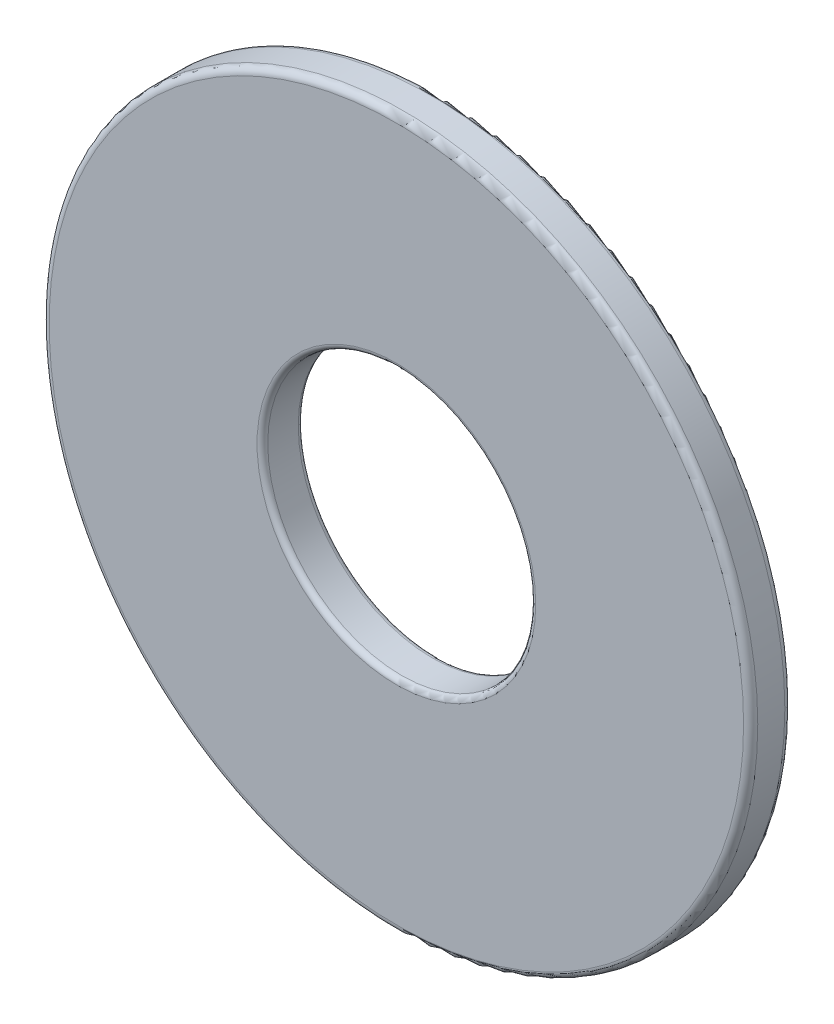
ISO-10303-21;
HEADER;
FILE_DESCRIPTION(('STEP AP214'),'2;1');
FILE_NAME('part.step','',(''),(''),'','','');
FILE_SCHEMA(('AUTOMOTIVE_DESIGN { 1 0 10303 214 1 1 1 1 }'));
ENDSEC;
DATA;
#1=APPLICATION_CONTEXT('core data for automotive mechanical design processes');
#2=APPLICATION_PROTOCOL_DEFINITION('international standard','automotive_design',2000,#1);
#3=PRODUCT_CONTEXT('',#1,'mechanical');
#4=PRODUCT('Part','Part','',(#3));
#5=PRODUCT_RELATED_PRODUCT_CATEGORY('part','',(#4));
#6=PRODUCT_DEFINITION_FORMATION('','',#4);
#7=PRODUCT_DEFINITION_CONTEXT('part definition',#1,'design');
#8=PRODUCT_DEFINITION('design','',#6,#7);
#9=PRODUCT_DEFINITION_SHAPE('','',#8);
#10=(LENGTH_UNIT() NAMED_UNIT(*) SI_UNIT(.MILLI.,.METRE.));
#11=(NAMED_UNIT(*) PLANE_ANGLE_UNIT() SI_UNIT($,.RADIAN.));
#12=(NAMED_UNIT(*) SI_UNIT($,.STERADIAN.) SOLID_ANGLE_UNIT());
#13=UNCERTAINTY_MEASURE_WITH_UNIT(LENGTH_MEASURE(1.E-05),#10,'distance_accuracy_value','');
#14=(GEOMETRIC_REPRESENTATION_CONTEXT(3) GLOBAL_UNCERTAINTY_ASSIGNED_CONTEXT((#13)) GLOBAL_UNIT_ASSIGNED_CONTEXT((#10,
#11,#12)) REPRESENTATION_CONTEXT('',''));
#15=CARTESIAN_POINT('',(0.,0.,0.));
#16=DIRECTION('',(0.,0.,1.));
#17=DIRECTION('',(1.,0.,0.));
#18=AXIS2_PLACEMENT_3D('',#15,#16,#17);
#19=CARTESIAN_POINT('',(0.,0.,0.507999999999999));
#20=DIRECTION('',(0.,0.,1.));
#21=DIRECTION('',(1.,0.,0.));
#22=AXIS2_PLACEMENT_3D('',#19,#20,#21);
#23=PLANE('',#22);
#24=CARTESIAN_POINT('',(0.,0.,0.507999999999999));
#25=DIRECTION('',(0.,0.,1.));
#26=DIRECTION('',(1.,0.,0.));
#27=AXIS2_PLACEMENT_3D('',#24,#25,#26);
#28=CIRCLE('',#27,8.556625);
#29=CARTESIAN_POINT('',(8.556625,0.,0.507999999999999));
#30=VERTEX_POINT('',#29);
#31=EDGE_CURVE('E10',#30,#30,#28,.T.);
#32=ORIENTED_EDGE('',*,*,#31,.T.);
#33=EDGE_LOOP('',(#32));
#34=FACE_BOUND('',#33,.T.);
#35=CARTESIAN_POINT('',(0.,0.,0.507999999999999));
#36=DIRECTION('',(0.,0.,1.));
#37=DIRECTION('',(1.,0.,0.));
#38=AXIS2_PLACEMENT_3D('',#35,#36,#37);
#39=CIRCLE('',#38,3.43408);
#40=CARTESIAN_POINT('',(3.43408,0.,0.507999999999999));
#41=VERTEX_POINT('',#40);
#42=EDGE_CURVE('E67',#41,#41,#39,.F.);
#43=ORIENTED_EDGE('',*,*,#42,.T.);
#44=EDGE_LOOP('',(#43));
#45=FACE_BOUND('',#44,.T.);
#46=ADVANCED_FACE('F41',(#34,#45),#23,.T.);
#47=CARTESIAN_POINT('',(0.,0.,0.507999999999999));
#48=DIRECTION('',(0.,0.,-1.));
#49=DIRECTION('',(-1.,0.,0.));
#50=AXIS2_PLACEMENT_3D('',#47,#48,#49);
#51=CYLINDRICAL_SURFACE('',#50,8.73125);
#52=CARTESIAN_POINT('',(0.,0.,-0.333375000000001));
#53=DIRECTION('',(0.,0.,1.));
#54=DIRECTION('',(1.,0.,0.));
#55=AXIS2_PLACEMENT_3D('',#52,#53,#54);
#56=CIRCLE('',#55,8.73125);
#57=CARTESIAN_POINT('',(8.73125,0.,-0.333375000000001));
#58=VERTEX_POINT('',#57);
#59=EDGE_CURVE('E55',#58,#58,#56,.T.);
#60=ORIENTED_EDGE('',*,*,#59,.T.);
#61=EDGE_LOOP('',(#60));
#62=FACE_BOUND('',#61,.T.);
#63=CARTESIAN_POINT('',(0.,0.,0.333374999999999));
#64=DIRECTION('',(0.,0.,1.));
#65=DIRECTION('',(1.,0.,0.));
#66=AXIS2_PLACEMENT_3D('',#63,#64,#65);
#67=CIRCLE('',#66,8.73125);
#68=CARTESIAN_POINT('',(8.73125,0.,0.333374999999999));
#69=VERTEX_POINT('',#68);
#70=EDGE_CURVE('E61',#69,#69,#67,.F.);
#71=ORIENTED_EDGE('',*,*,#70,.T.);
#72=EDGE_LOOP('',(#71));
#73=FACE_BOUND('',#72,.T.);
#74=ADVANCED_FACE('F105',(#62,#73),#51,.T.);
#75=CARTESIAN_POINT('',(0.,0.,0.507999999999999));
#76=DIRECTION('',(0.,0.,-1.));
#77=DIRECTION('',(-1.,0.,0.));
#78=AXIS2_PLACEMENT_3D('',#75,#76,#77);
#79=CYLINDRICAL_SURFACE('',#78,3.302);
#80=CARTESIAN_POINT('',(0.,0.,-0.375920000000001));
#81=DIRECTION('',(0.,0.,1.));
#82=DIRECTION('',(1.,0.,0.));
#83=AXIS2_PLACEMENT_3D('',#80,#81,#82);
#84=CIRCLE('',#83,3.302);
#85=CARTESIAN_POINT('',(3.302,0.,-0.375920000000001));
#86=VERTEX_POINT('',#85);
#87=EDGE_CURVE('E71',#86,#86,#84,.F.);
#88=ORIENTED_EDGE('',*,*,#87,.T.);
#89=EDGE_LOOP('',(#88));
#90=FACE_BOUND('',#89,.T.);
#91=CARTESIAN_POINT('',(0.,0.,0.375919999999999));
#92=DIRECTION('',(0.,0.,1.));
#93=DIRECTION('',(1.,0.,0.));
#94=AXIS2_PLACEMENT_3D('',#91,#92,#93);
#95=CIRCLE('',#94,3.302);
#96=CARTESIAN_POINT('',(3.302,0.,0.375919999999999));
#97=VERTEX_POINT('',#96);
#98=EDGE_CURVE('E75',#97,#97,#95,.T.);
#99=ORIENTED_EDGE('',*,*,#98,.T.);
#100=EDGE_LOOP('',(#99));
#101=FACE_BOUND('',#100,.T.);
#102=ADVANCED_FACE('F100',(#90,#101),#79,.F.);
#103=CARTESIAN_POINT('',(0.,0.,-0.508000000000001));
#104=DIRECTION('',(0.,0.,1.));
#105=DIRECTION('',(1.,0.,0.));
#106=AXIS2_PLACEMENT_3D('',#103,#104,#105);
#107=PLANE('',#106);
#108=CARTESIAN_POINT('',(0.,0.,-0.508000000000001));
#109=DIRECTION('',(0.,0.,1.));
#110=DIRECTION('',(1.,0.,0.));
#111=AXIS2_PLACEMENT_3D('',#108,#109,#110);
#112=CIRCLE('',#111,8.556625);
#113=CARTESIAN_POINT('',(8.556625,0.,-0.508000000000001));
#114=VERTEX_POINT('',#113);
#115=EDGE_CURVE('E49',#114,#114,#112,.F.);
#116=ORIENTED_EDGE('',*,*,#115,.T.);
#117=EDGE_LOOP('',(#116));
#118=FACE_BOUND('',#117,.T.);
#119=CARTESIAN_POINT('',(0.,0.,-0.508000000000001));
#120=DIRECTION('',(0.,0.,1.));
#121=DIRECTION('',(1.,0.,0.));
#122=AXIS2_PLACEMENT_3D('',#119,#120,#121);
#123=CIRCLE('',#122,3.43408);
#124=CARTESIAN_POINT('',(3.43408,0.,-0.508000000000001));
#125=VERTEX_POINT('',#124);
#126=EDGE_CURVE('E79',#125,#125,#123,.T.);
#127=ORIENTED_EDGE('',*,*,#126,.T.);
#128=EDGE_LOOP('',(#127));
#129=FACE_BOUND('',#128,.T.);
#130=ADVANCED_FACE('F85',(#118,#129),#107,.F.);
#131=CARTESIAN_POINT('',(0.,0.,-0.375920000000001));
#132=DIRECTION('',(0.,0.,1.));
#133=DIRECTION('',(1.,0.,0.));
#134=AXIS2_PLACEMENT_3D('',#131,#132,#133);
#135=TOROIDAL_SURFACE('',#134,3.43408,0.13208);
#136=ORIENTED_EDGE('',*,*,#87,.F.);
#137=EDGE_LOOP('',(#136));
#138=FACE_BOUND('',#137,.T.);
#139=ORIENTED_EDGE('',*,*,#126,.F.);
#140=EDGE_LOOP('',(#139));
#141=FACE_BOUND('',#140,.T.);
#142=ADVANCED_FACE('F87',(#138,#141),#135,.T.);
#143=CARTESIAN_POINT('',(0.,0.,0.375919999999999));
#144=DIRECTION('',(0.,0.,1.));
#145=DIRECTION('',(1.,0.,0.));
#146=AXIS2_PLACEMENT_3D('',#143,#144,#145);
#147=TOROIDAL_SURFACE('',#146,3.43408,0.13208);
#148=ORIENTED_EDGE('',*,*,#42,.F.);
#149=EDGE_LOOP('',(#148));
#150=FACE_BOUND('',#149,.T.);
#151=ORIENTED_EDGE('',*,*,#98,.F.);
#152=EDGE_LOOP('',(#151));
#153=FACE_BOUND('',#152,.T.);
#154=ADVANCED_FACE('F89',(#150,#153),#147,.T.);
#155=CARTESIAN_POINT('',(0.,0.,-0.333375000000001));
#156=DIRECTION('',(0.,0.,1.));
#157=DIRECTION('',(1.,0.,0.));
#158=AXIS2_PLACEMENT_3D('',#155,#156,#157);
#159=TOROIDAL_SURFACE('',#158,8.556625,0.174625);
#160=ORIENTED_EDGE('',*,*,#115,.F.);
#161=EDGE_LOOP('',(#160));
#162=FACE_BOUND('',#161,.T.);
#163=ORIENTED_EDGE('',*,*,#59,.F.);
#164=EDGE_LOOP('',(#163));
#165=FACE_BOUND('',#164,.T.);
#166=ADVANCED_FACE('F96',(#162,#165),#159,.T.);
#167=CARTESIAN_POINT('',(0.,0.,0.333374999999999));
#168=DIRECTION('',(0.,0.,1.));
#169=DIRECTION('',(1.,0.,0.));
#170=AXIS2_PLACEMENT_3D('',#167,#168,#169);
#171=TOROIDAL_SURFACE('',#170,8.556625,0.174625);
#172=ORIENTED_EDGE('',*,*,#70,.F.);
#173=EDGE_LOOP('',(#172));
#174=FACE_BOUND('',#173,.T.);
#175=ORIENTED_EDGE('',*,*,#31,.F.);
#176=EDGE_LOOP('',(#175));
#177=FACE_BOUND('',#176,.T.);
#178=ADVANCED_FACE('F43',(#174,#177),#171,.T.);
#179=CLOSED_SHELL('',(#46,#74,#102,#130,#142,#154,#166,#178));
#180=MANIFOLD_SOLID_BREP('B2',#179);
#181=ADVANCED_BREP_SHAPE_REPRESENTATION('',(#18,#180),#14);
#182=SHAPE_DEFINITION_REPRESENTATION(#9,#181);
ENDSEC;
END-ISO-10303-21;
